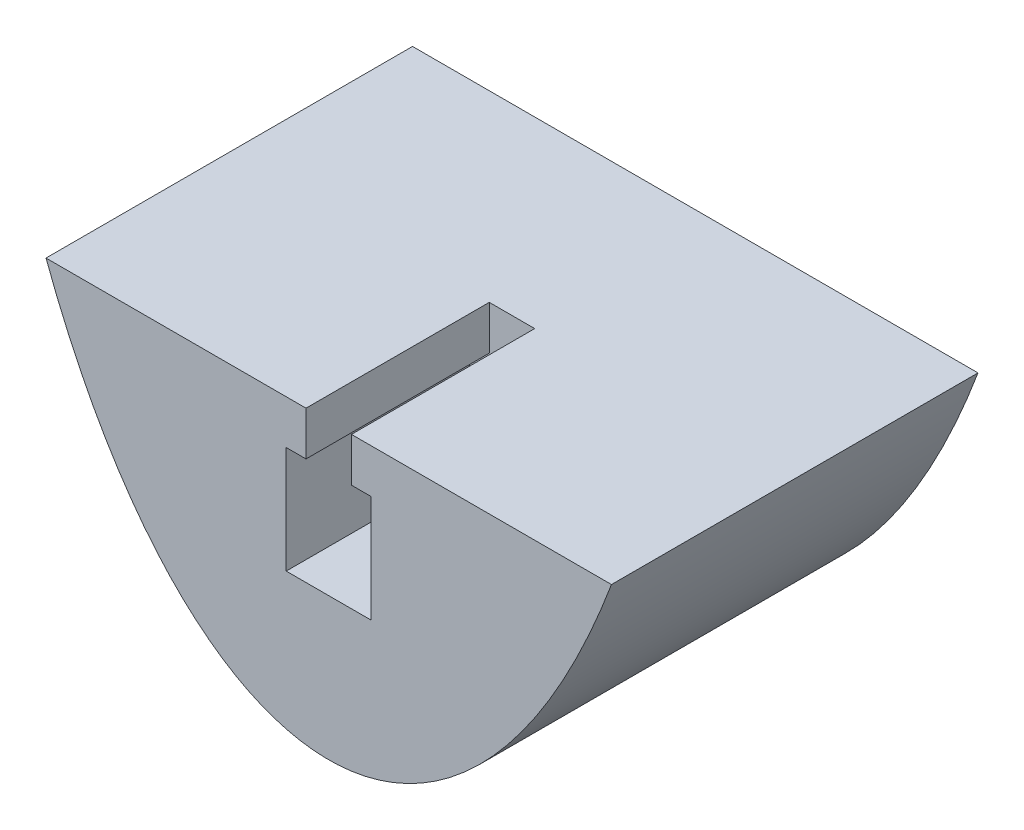
ISO-10303-21;
HEADER;
FILE_DESCRIPTION(('STEP AP214'),'2;1');
FILE_NAME('part.step','',(''),(''),'','','');
FILE_SCHEMA(('AUTOMOTIVE_DESIGN { 1 0 10303 214 1 1 1 1 }'));
ENDSEC;
DATA;
#1=APPLICATION_CONTEXT('core data for automotive mechanical design processes');
#2=APPLICATION_PROTOCOL_DEFINITION('international standard','automotive_design',2000,#1);
#3=PRODUCT_CONTEXT('',#1,'mechanical');
#4=PRODUCT('Part','Part','',(#3));
#5=PRODUCT_RELATED_PRODUCT_CATEGORY('part','',(#4));
#6=PRODUCT_DEFINITION_FORMATION('','',#4);
#7=PRODUCT_DEFINITION_CONTEXT('part definition',#1,'design');
#8=PRODUCT_DEFINITION('design','',#6,#7);
#9=PRODUCT_DEFINITION_SHAPE('','',#8);
#10=(LENGTH_UNIT() NAMED_UNIT(*) SI_UNIT(.MILLI.,.METRE.));
#11=(NAMED_UNIT(*) PLANE_ANGLE_UNIT() SI_UNIT($,.RADIAN.));
#12=(NAMED_UNIT(*) SI_UNIT($,.STERADIAN.) SOLID_ANGLE_UNIT());
#13=UNCERTAINTY_MEASURE_WITH_UNIT(LENGTH_MEASURE(1.E-05),#10,'distance_accuracy_value','');
#14=(GEOMETRIC_REPRESENTATION_CONTEXT(3) GLOBAL_UNCERTAINTY_ASSIGNED_CONTEXT((#13)) GLOBAL_UNIT_ASSIGNED_CONTEXT((#10,
#11,#12)) REPRESENTATION_CONTEXT('',''));
#15=CARTESIAN_POINT('',(0.,0.,0.));
#16=DIRECTION('',(0.,0.,1.));
#17=DIRECTION('',(1.,0.,0.));
#18=AXIS2_PLACEMENT_3D('',#15,#16,#17);
#19=CARTESIAN_POINT('',(5.43844595960926,-64.9459050407809,25.));
#20=DIRECTION('',(0.,-1.,0.));
#21=DIRECTION('',(1.,0.,0.));
#22=AXIS2_PLACEMENT_3D('',#19,#20,#21);
#23=PLANE('',#22);
#24=DIRECTION('',(0.,0.,1.));
#25=VECTOR('',#24,1.);
#26=CARTESIAN_POINT('',(26.2729067516028,-64.9459050407809,0.));
#27=LINE('',#26,#25);
#28=CARTESIAN_POINT('',(26.2729067516028,-64.9459050407809,12.5));
#29=VERTEX_POINT('',#28);
#30=CARTESIAN_POINT('',(26.2729067516028,-64.9459050407809,25.));
#31=VERTEX_POINT('',#30);
#32=EDGE_CURVE('E207',#29,#31,#27,.T.);
#33=ORIENTED_EDGE('',*,*,#32,.T.);
#34=DIRECTION('',(-1.,0.,0.));
#35=VECTOR('',#34,1.);
#36=CARTESIAN_POINT('',(5.43844595960926,-64.9459050407809,25.));
#37=LINE('',#36,#35);
#38=CARTESIAN_POINT('',(44.0079067516028,-64.9459050407809,25.));
#39=VERTEX_POINT('',#38);
#40=EDGE_CURVE('E114',#39,#31,#37,.T.);
#41=ORIENTED_EDGE('',*,*,#40,.F.);
#42=DIRECTION('',(0.,0.,-1.));
#43=VECTOR('',#42,1.);
#44=CARTESIAN_POINT('',(44.0079067516028,-64.9459050407809,25.));
#45=LINE('',#44,#43);
#46=CARTESIAN_POINT('',(44.0079067516028,-64.9459050407809,0.));
#47=VERTEX_POINT('',#46);
#48=EDGE_CURVE('E11',#39,#47,#45,.T.);
#49=ORIENTED_EDGE('',*,*,#48,.T.);
#50=DIRECTION('',(-1.,0.,0.));
#51=VECTOR('',#50,1.);
#52=CARTESIAN_POINT('',(5.43844595960926,-64.9459050407809,0.));
#53=LINE('',#52,#51);
#54=CARTESIAN_POINT('',(5.43844595960926,-64.9459050407809,0.));
#55=VERTEX_POINT('',#54);
#56=EDGE_CURVE('E65',#47,#55,#53,.T.);
#57=ORIENTED_EDGE('',*,*,#56,.T.);
#58=DIRECTION('',(0.,0.,-1.));
#59=VECTOR('',#58,1.);
#60=CARTESIAN_POINT('',(5.43844595960926,-64.9459050407809,25.));
#61=LINE('',#60,#59);
#62=CARTESIAN_POINT('',(5.43844595960926,-64.9459050407809,25.));
#63=VERTEX_POINT('',#62);
#64=EDGE_CURVE('E46',#63,#55,#61,.T.);
#65=ORIENTED_EDGE('',*,*,#64,.F.);
#66=CARTESIAN_POINT('',(23.1729067516028,-64.9459050407809,25.));
#67=VERTEX_POINT('',#66);
#68=EDGE_CURVE('E54',#67,#63,#37,.T.);
#69=ORIENTED_EDGE('',*,*,#68,.F.);
#70=DIRECTION('',(0.,0.,1.));
#71=VECTOR('',#70,1.);
#72=CARTESIAN_POINT('',(23.1729067516028,-64.9459050407809,0.));
#73=LINE('',#72,#71);
#74=CARTESIAN_POINT('',(23.1729067516028,-64.9459050407809,12.5));
#75=VERTEX_POINT('',#74);
#76=EDGE_CURVE('E90',#75,#67,#73,.T.);
#77=ORIENTED_EDGE('',*,*,#76,.F.);
#78=DIRECTION('',(1.,0.,0.));
#79=VECTOR('',#78,1.);
#80=CARTESIAN_POINT('',(0.,-64.9459050407809,12.5));
#81=LINE('',#80,#79);
#82=EDGE_CURVE('E101',#75,#29,#81,.T.);
#83=ORIENTED_EDGE('',*,*,#82,.T.);
#84=EDGE_LOOP('',(#33,#41,#49,#57,#65,#69,#77,#83));
#85=FACE_BOUND('',#84,.T.);
#86=ADVANCED_FACE('F36',(#85),#23,.F.);
#87=CARTESIAN_POINT('',(24.723176355606,-29.9459050407809,25.));
#88=DIRECTION('',(0.,0.,1.));
#89=DIRECTION('',(1.,0.,0.));
#90=AXIS2_PLACEMENT_3D('',#87,#88,#89);
#91=PLANE('',#90);
#92=DIRECTION('',(1.,0.,0.));
#93=VECTOR('',#92,1.);
#94=CARTESIAN_POINT('',(21.8229067516028,-67.9459050407809,25.));
#95=LINE('',#94,#93);
#96=CARTESIAN_POINT('',(26.2729067516028,-67.9459050407809,25.));
#97=VERTEX_POINT('',#96);
#98=CARTESIAN_POINT('',(27.6229067516028,-67.9459050407809,25.));
#99=VERTEX_POINT('',#98);
#100=EDGE_CURVE('E190',#97,#99,#95,.T.);
#101=ORIENTED_EDGE('',*,*,#100,.T.);
#102=DIRECTION('',(0.,1.,0.));
#103=VECTOR('',#102,1.);
#104=CARTESIAN_POINT('',(27.6229067516028,-75.2459050407809,25.));
#105=LINE('',#104,#103);
#106=CARTESIAN_POINT('',(27.6229067516028,-75.2459050407809,25.));
#107=VERTEX_POINT('',#106);
#108=EDGE_CURVE('E186',#107,#99,#105,.T.);
#109=ORIENTED_EDGE('',*,*,#108,.F.);
#110=DIRECTION('',(1.,0.,0.));
#111=VECTOR('',#110,1.);
#112=CARTESIAN_POINT('',(21.8229067516028,-75.2459050407809,25.));
#113=LINE('',#112,#111);
#114=CARTESIAN_POINT('',(21.8229067516028,-75.2459050407809,25.));
#115=VERTEX_POINT('',#114);
#116=EDGE_CURVE('E172',#115,#107,#113,.T.);
#117=ORIENTED_EDGE('',*,*,#116,.F.);
#118=DIRECTION('',(0.,1.,0.));
#119=VECTOR('',#118,1.);
#120=CARTESIAN_POINT('',(21.8229067516028,-75.2459050407809,25.));
#121=LINE('',#120,#119);
#122=CARTESIAN_POINT('',(21.8229067516028,-67.9459050407809,25.));
#123=VERTEX_POINT('',#122);
#124=EDGE_CURVE('E209',#115,#123,#121,.T.);
#125=ORIENTED_EDGE('',*,*,#124,.T.);
#126=CARTESIAN_POINT('',(23.1729067516028,-67.9459050407809,25.));
#127=VERTEX_POINT('',#126);
#128=EDGE_CURVE('E108',#123,#127,#95,.T.);
#129=ORIENTED_EDGE('',*,*,#128,.T.);
#130=DIRECTION('',(0.,1.,0.));
#131=VECTOR('',#130,1.);
#132=CARTESIAN_POINT('',(23.1729067516028,-67.9459050407809,25.));
#133=LINE('',#132,#131);
#134=EDGE_CURVE('E94',#127,#67,#133,.T.);
#135=ORIENTED_EDGE('',*,*,#134,.T.);
#136=ORIENTED_EDGE('',*,*,#68,.T.);
#137=CARTESIAN_POINT('',(24.723176355606,-29.9459050407809,25.));
#138=DIRECTION('',(0.,0.,1.));
#139=DIRECTION('',(0.,-1.,0.));
#140=AXIS2_PLACEMENT_3D('',#137,#138,#139);
#141=ELLIPSE('',#140,55.,25.);
#142=EDGE_CURVE('E115',#63,#39,#141,.T.);
#143=ORIENTED_EDGE('',*,*,#142,.T.);
#144=ORIENTED_EDGE('',*,*,#40,.T.);
#145=DIRECTION('',(0.,1.,0.));
#146=VECTOR('',#145,1.);
#147=CARTESIAN_POINT('',(26.2729067516028,-67.9459050407809,25.));
#148=LINE('',#147,#146);
#149=EDGE_CURVE('E109',#97,#31,#148,.T.);
#150=ORIENTED_EDGE('',*,*,#149,.F.);
#151=EDGE_LOOP('',(#101,#109,#117,#125,#129,#135,#136,#143,#144,#150));
#152=FACE_BOUND('',#151,.T.);
#153=ADVANCED_FACE('F105',(#152),#91,.T.);
#154=DIRECTION('',(0.,0.,-1.));
#155=VECTOR('',#154,1.);
#156=SURFACE_OF_LINEAR_EXTRUSION('',#141,#155);
#157=CARTESIAN_POINT('',(24.723176355606,-29.9459050407809,0.));
#158=DIRECTION('',(0.,0.,1.));
#159=DIRECTION('',(0.,-1.,0.));
#160=AXIS2_PLACEMENT_3D('',#157,#158,#159);
#161=ELLIPSE('',#160,55.,25.);
#162=EDGE_CURVE('E121',#55,#47,#161,.T.);
#163=ORIENTED_EDGE('',*,*,#162,.T.);
#164=ORIENTED_EDGE('',*,*,#48,.F.);
#165=ORIENTED_EDGE('',*,*,#142,.F.);
#166=ORIENTED_EDGE('',*,*,#64,.T.);
#167=EDGE_LOOP('',(#163,#164,#165,#166));
#168=FACE_BOUND('',#167,.T.);
#169=ADVANCED_FACE('F38',(#168),#156,.F.);
#170=CARTESIAN_POINT('',(24.723176355606,-29.9459050407809,0.));
#171=DIRECTION('',(0.,0.,1.));
#172=DIRECTION('',(1.,0.,0.));
#173=AXIS2_PLACEMENT_3D('',#170,#171,#172);
#174=PLANE('',#173);
#175=ORIENTED_EDGE('',*,*,#162,.F.);
#176=ORIENTED_EDGE('',*,*,#56,.F.);
#177=EDGE_LOOP('',(#175,#176));
#178=FACE_BOUND('',#177,.T.);
#179=ADVANCED_FACE('F126',(#178),#174,.F.);
#180=CARTESIAN_POINT('',(26.2729067516028,-67.9459050407809,0.));
#181=DIRECTION('',(-1.,0.,0.));
#182=DIRECTION('',(0.,-1.,0.));
#183=AXIS2_PLACEMENT_3D('',#180,#181,#182);
#184=PLANE('',#183);
#185=ORIENTED_EDGE('',*,*,#32,.F.);
#186=DIRECTION('',(0.,1.,0.));
#187=VECTOR('',#186,1.);
#188=CARTESIAN_POINT('',(26.2729067516028,-67.9459050407809,12.5));
#189=LINE('',#188,#187);
#190=CARTESIAN_POINT('',(26.2729067516028,-67.9459050407809,12.5));
#191=VERTEX_POINT('',#190);
#192=EDGE_CURVE('E206',#191,#29,#189,.T.);
#193=ORIENTED_EDGE('',*,*,#192,.F.);
#194=DIRECTION('',(0.,0.,1.));
#195=VECTOR('',#194,1.);
#196=CARTESIAN_POINT('',(26.2729067516028,-67.9459050407809,0.));
#197=LINE('',#196,#195);
#198=EDGE_CURVE('E100',#191,#97,#197,.T.);
#199=ORIENTED_EDGE('',*,*,#198,.T.);
#200=ORIENTED_EDGE('',*,*,#149,.T.);
#201=EDGE_LOOP('',(#185,#193,#199,#200));
#202=FACE_BOUND('',#201,.T.);
#203=ADVANCED_FACE('F128',(#202),#184,.T.);
#204=CARTESIAN_POINT('',(23.1729067516028,-67.9459050407809,0.));
#205=DIRECTION('',(-1.,0.,0.));
#206=DIRECTION('',(0.,-1.,0.));
#207=AXIS2_PLACEMENT_3D('',#204,#205,#206);
#208=PLANE('',#207);
#209=ORIENTED_EDGE('',*,*,#76,.T.);
#210=ORIENTED_EDGE('',*,*,#134,.F.);
#211=DIRECTION('',(0.,0.,1.));
#212=VECTOR('',#211,1.);
#213=CARTESIAN_POINT('',(23.1729067516028,-67.9459050407809,0.));
#214=LINE('',#213,#212);
#215=CARTESIAN_POINT('',(23.1729067516028,-67.9459050407809,12.5));
#216=VERTEX_POINT('',#215);
#217=EDGE_CURVE('E203',#216,#127,#214,.T.);
#218=ORIENTED_EDGE('',*,*,#217,.F.);
#219=DIRECTION('',(0.,1.,0.));
#220=VECTOR('',#219,1.);
#221=CARTESIAN_POINT('',(23.1729067516028,-67.9459050407809,12.5));
#222=LINE('',#221,#220);
#223=EDGE_CURVE('E96',#216,#75,#222,.T.);
#224=ORIENTED_EDGE('',*,*,#223,.T.);
#225=EDGE_LOOP('',(#209,#210,#218,#224));
#226=FACE_BOUND('',#225,.T.);
#227=ADVANCED_FACE('F91',(#226),#208,.F.);
#228=CARTESIAN_POINT('',(0.,-67.9459050407809,12.5));
#229=DIRECTION('',(0.,0.,1.));
#230=DIRECTION('',(1.,0.,0.));
#231=AXIS2_PLACEMENT_3D('',#228,#229,#230);
#232=PLANE('',#231);
#233=ORIENTED_EDGE('',*,*,#82,.F.);
#234=ORIENTED_EDGE('',*,*,#223,.F.);
#235=DIRECTION('',(-1.,0.,0.));
#236=VECTOR('',#235,1.);
#237=CARTESIAN_POINT('',(21.8229067516028,-67.9459050407809,12.5));
#238=LINE('',#237,#236);
#239=CARTESIAN_POINT('',(21.8229067516028,-67.9459050407809,12.5));
#240=VERTEX_POINT('',#239);
#241=EDGE_CURVE('E240',#216,#240,#238,.T.);
#242=ORIENTED_EDGE('',*,*,#241,.T.);
#243=DIRECTION('',(0.,1.,0.));
#244=VECTOR('',#243,1.);
#245=CARTESIAN_POINT('',(21.8229067516028,-75.2459050407809,12.5));
#246=LINE('',#245,#244);
#247=CARTESIAN_POINT('',(21.8229067516028,-75.2459050407809,12.5));
#248=VERTEX_POINT('',#247);
#249=EDGE_CURVE('E195',#248,#240,#246,.T.);
#250=ORIENTED_EDGE('',*,*,#249,.F.);
#251=DIRECTION('',(-1.,0.,0.));
#252=VECTOR('',#251,1.);
#253=CARTESIAN_POINT('',(21.8229067516028,-75.2459050407809,12.5));
#254=LINE('',#253,#252);
#255=CARTESIAN_POINT('',(27.6229067516028,-75.2459050407809,12.5));
#256=VERTEX_POINT('',#255);
#257=EDGE_CURVE('E197',#256,#248,#254,.T.);
#258=ORIENTED_EDGE('',*,*,#257,.F.);
#259=DIRECTION('',(0.,1.,0.));
#260=VECTOR('',#259,1.);
#261=CARTESIAN_POINT('',(27.6229067516028,-75.2459050407809,12.5));
#262=LINE('',#261,#260);
#263=CARTESIAN_POINT('',(27.6229067516028,-67.9459050407809,12.5));
#264=VERTEX_POINT('',#263);
#265=EDGE_CURVE('E193',#256,#264,#262,.T.);
#266=ORIENTED_EDGE('',*,*,#265,.T.);
#267=EDGE_CURVE('E73',#264,#191,#238,.T.);
#268=ORIENTED_EDGE('',*,*,#267,.T.);
#269=ORIENTED_EDGE('',*,*,#192,.T.);
#270=EDGE_LOOP('',(#233,#234,#242,#250,#258,#266,#268,#269));
#271=FACE_BOUND('',#270,.T.);
#272=ADVANCED_FACE('F144',(#271),#232,.T.);
#273=CARTESIAN_POINT('',(0.,-67.9459050407809,0.));
#274=DIRECTION('',(0.,1.,0.));
#275=DIRECTION('',(0.,0.,1.));
#276=AXIS2_PLACEMENT_3D('',#273,#274,#275);
#277=PLANE('',#276);
#278=ORIENTED_EDGE('',*,*,#128,.F.);
#279=DIRECTION('',(0.,0.,1.));
#280=VECTOR('',#279,1.);
#281=CARTESIAN_POINT('',(21.8229067516028,-67.9459050407809,25.));
#282=LINE('',#281,#280);
#283=EDGE_CURVE('E183',#240,#123,#282,.T.);
#284=ORIENTED_EDGE('',*,*,#283,.F.);
#285=ORIENTED_EDGE('',*,*,#241,.F.);
#286=ORIENTED_EDGE('',*,*,#217,.T.);
#287=EDGE_LOOP('',(#278,#284,#285,#286));
#288=FACE_BOUND('',#287,.T.);
#289=ADVANCED_FACE('F147',(#288),#277,.F.);
#290=CARTESIAN_POINT('',(21.8229067516028,-75.2459050407809,25.));
#291=DIRECTION('',(-1.,0.,0.));
#292=DIRECTION('',(0.,-1.,0.));
#293=AXIS2_PLACEMENT_3D('',#290,#291,#292);
#294=PLANE('',#293);
#295=ORIENTED_EDGE('',*,*,#283,.T.);
#296=ORIENTED_EDGE('',*,*,#124,.F.);
#297=DIRECTION('',(0.,0.,1.));
#298=VECTOR('',#297,1.);
#299=CARTESIAN_POINT('',(21.8229067516028,-75.2459050407809,25.));
#300=LINE('',#299,#298);
#301=EDGE_CURVE('E180',#248,#115,#300,.T.);
#302=ORIENTED_EDGE('',*,*,#301,.F.);
#303=ORIENTED_EDGE('',*,*,#249,.T.);
#304=EDGE_LOOP('',(#295,#296,#302,#303));
#305=FACE_BOUND('',#304,.T.);
#306=ADVANCED_FACE('F154',(#305),#294,.F.);
#307=CARTESIAN_POINT('',(27.6229067516028,-75.2459050407809,25.));
#308=DIRECTION('',(1.,0.,0.));
#309=DIRECTION('',(0.,1.,0.));
#310=AXIS2_PLACEMENT_3D('',#307,#308,#309);
#311=PLANE('',#310);
#312=DIRECTION('',(0.,0.,-1.));
#313=VECTOR('',#312,1.);
#314=CARTESIAN_POINT('',(27.6229067516028,-67.9459050407809,25.));
#315=LINE('',#314,#313);
#316=EDGE_CURVE('E233',#99,#264,#315,.T.);
#317=ORIENTED_EDGE('',*,*,#316,.T.);
#318=ORIENTED_EDGE('',*,*,#265,.F.);
#319=DIRECTION('',(0.,0.,-1.));
#320=VECTOR('',#319,1.);
#321=CARTESIAN_POINT('',(27.6229067516028,-75.2459050407809,25.));
#322=LINE('',#321,#320);
#323=EDGE_CURVE('E177',#107,#256,#322,.T.);
#324=ORIENTED_EDGE('',*,*,#323,.F.);
#325=ORIENTED_EDGE('',*,*,#108,.T.);
#326=EDGE_LOOP('',(#317,#318,#324,#325));
#327=FACE_BOUND('',#326,.T.);
#328=ADVANCED_FACE('F150',(#327),#311,.F.);
#329=CARTESIAN_POINT('',(0.,-75.2459050407809,0.));
#330=DIRECTION('',(0.,1.,0.));
#331=DIRECTION('',(0.,0.,1.));
#332=AXIS2_PLACEMENT_3D('',#329,#330,#331);
#333=PLANE('',#332);
#334=ORIENTED_EDGE('',*,*,#116,.T.);
#335=ORIENTED_EDGE('',*,*,#323,.T.);
#336=ORIENTED_EDGE('',*,*,#257,.T.);
#337=ORIENTED_EDGE('',*,*,#301,.T.);
#338=EDGE_LOOP('',(#334,#335,#336,#337));
#339=FACE_BOUND('',#338,.T.);
#340=ADVANCED_FACE('F153',(#339),#333,.T.);
#341=ORIENTED_EDGE('',*,*,#198,.F.);
#342=ORIENTED_EDGE('',*,*,#267,.F.);
#343=ORIENTED_EDGE('',*,*,#316,.F.);
#344=ORIENTED_EDGE('',*,*,#100,.F.);
#345=EDGE_LOOP('',(#341,#342,#343,#344));
#346=FACE_BOUND('',#345,.T.);
#347=ADVANCED_FACE('F159',(#346),#277,.F.);
#348=CLOSED_SHELL('',(#86,#153,#169,#179,#203,#227,#272,#289,#306,#328,#340,#347));
#349=MANIFOLD_SOLID_BREP('B2',#348);
#350=ADVANCED_BREP_SHAPE_REPRESENTATION('',(#18,#349),#14);
#351=SHAPE_DEFINITION_REPRESENTATION(#9,#350);
ENDSEC;
END-ISO-10303-21;
